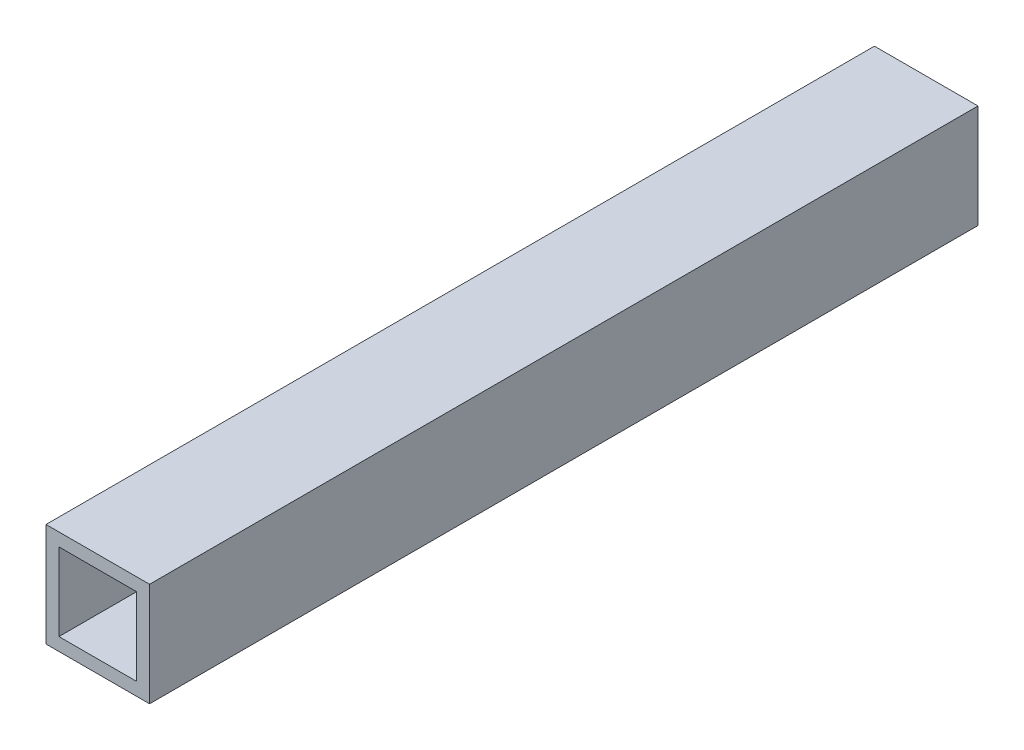
ISO-10303-21;
HEADER;
FILE_DESCRIPTION(('STEP AP214'),'2;1');
FILE_NAME('part.step','',(''),(''),'','','');
FILE_SCHEMA(('AUTOMOTIVE_DESIGN { 1 0 10303 214 1 1 1 1 }'));
ENDSEC;
DATA;
#1=APPLICATION_CONTEXT('core data for automotive mechanical design processes');
#2=APPLICATION_PROTOCOL_DEFINITION('international standard','automotive_design',2000,#1);
#3=PRODUCT_CONTEXT('',#1,'mechanical');
#4=PRODUCT('Part','Part','',(#3));
#5=PRODUCT_RELATED_PRODUCT_CATEGORY('part','',(#4));
#6=PRODUCT_DEFINITION_FORMATION('','',#4);
#7=PRODUCT_DEFINITION_CONTEXT('part definition',#1,'design');
#8=PRODUCT_DEFINITION('design','',#6,#7);
#9=PRODUCT_DEFINITION_SHAPE('','',#8);
#10=(LENGTH_UNIT() NAMED_UNIT(*) SI_UNIT(.MILLI.,.METRE.));
#11=(NAMED_UNIT(*) PLANE_ANGLE_UNIT() SI_UNIT($,.RADIAN.));
#12=(NAMED_UNIT(*) SI_UNIT($,.STERADIAN.) SOLID_ANGLE_UNIT());
#13=UNCERTAINTY_MEASURE_WITH_UNIT(LENGTH_MEASURE(1.E-05),#10,'distance_accuracy_value','');
#14=(GEOMETRIC_REPRESENTATION_CONTEXT(3) GLOBAL_UNCERTAINTY_ASSIGNED_CONTEXT((#13)) GLOBAL_UNIT_ASSIGNED_CONTEXT((#10,
#11,#12)) REPRESENTATION_CONTEXT('',''));
#15=CARTESIAN_POINT('',(0.,0.,0.));
#16=DIRECTION('',(0.,0.,1.));
#17=DIRECTION('',(1.,0.,0.));
#18=AXIS2_PLACEMENT_3D('',#15,#16,#17);
#19=CARTESIAN_POINT('',(0.,0.,203.2));
#20=DIRECTION('',(0.,0.,1.));
#21=DIRECTION('',(1.,0.,0.));
#22=AXIS2_PLACEMENT_3D('',#19,#20,#21);
#23=PLANE('',#22);
#24=DIRECTION('',(0.,1.,0.));
#25=VECTOR('',#24,1.);
#26=CARTESIAN_POINT('',(0.,0.,203.2));
#27=LINE('',#26,#25);
#28=CARTESIAN_POINT('',(0.,0.,203.2));
#29=VERTEX_POINT('',#28);
#30=CARTESIAN_POINT('',(0.,25.4,203.2));
#31=VERTEX_POINT('',#30);
#32=EDGE_CURVE('E176',#29,#31,#27,.T.);
#33=ORIENTED_EDGE('',*,*,#32,.T.);
#34=DIRECTION('',(-1.,0.,0.));
#35=VECTOR('',#34,1.);
#36=CARTESIAN_POINT('',(0.,25.4,203.2));
#37=LINE('',#36,#35);
#38=CARTESIAN_POINT('',(-25.4,25.4,203.2));
#39=VERTEX_POINT('',#38);
#40=EDGE_CURVE('E180',#31,#39,#37,.T.);
#41=ORIENTED_EDGE('',*,*,#40,.T.);
#42=DIRECTION('',(0.,-1.,0.));
#43=VECTOR('',#42,1.);
#44=CARTESIAN_POINT('',(-25.4,0.,203.2));
#45=LINE('',#44,#43);
#46=CARTESIAN_POINT('',(-25.4,0.,203.2));
#47=VERTEX_POINT('',#46);
#48=EDGE_CURVE('E184',#39,#47,#45,.T.);
#49=ORIENTED_EDGE('',*,*,#48,.T.);
#50=DIRECTION('',(1.,0.,0.));
#51=VECTOR('',#50,1.);
#52=CARTESIAN_POINT('',(0.,0.,203.2));
#53=LINE('',#52,#51);
#54=EDGE_CURVE('E187',#47,#29,#53,.T.);
#55=ORIENTED_EDGE('',*,*,#54,.T.);
#56=EDGE_LOOP('',(#33,#41,#49,#55));
#57=FACE_BOUND('',#56,.T.);
#58=DIRECTION('',(-1.,0.,0.));
#59=VECTOR('',#58,1.);
#60=CARTESIAN_POINT('',(0.,22.225,203.2));
#61=LINE('',#60,#59);
#62=CARTESIAN_POINT('',(-3.175,22.225,203.2));
#63=VERTEX_POINT('',#62);
#64=CARTESIAN_POINT('',(-22.225,22.225,203.2));
#65=VERTEX_POINT('',#64);
#66=EDGE_CURVE('E137',#63,#65,#61,.T.);
#67=ORIENTED_EDGE('',*,*,#66,.F.);
#68=DIRECTION('',(0.,1.,0.));
#69=VECTOR('',#68,1.);
#70=CARTESIAN_POINT('',(-3.175,0.,203.2));
#71=LINE('',#70,#69);
#72=CARTESIAN_POINT('',(-3.175,3.175,203.2));
#73=VERTEX_POINT('',#72);
#74=EDGE_CURVE('E128',#73,#63,#71,.T.);
#75=ORIENTED_EDGE('',*,*,#74,.F.);
#76=DIRECTION('',(1.,0.,0.));
#77=VECTOR('',#76,1.);
#78=CARTESIAN_POINT('',(0.,3.175,203.2));
#79=LINE('',#78,#77);
#80=CARTESIAN_POINT('',(-22.225,3.175,203.2));
#81=VERTEX_POINT('',#80);
#82=EDGE_CURVE('E154',#81,#73,#79,.T.);
#83=ORIENTED_EDGE('',*,*,#82,.F.);
#84=DIRECTION('',(0.,-1.,0.));
#85=VECTOR('',#84,1.);
#86=CARTESIAN_POINT('',(-22.225,0.,203.2));
#87=LINE('',#86,#85);
#88=EDGE_CURVE('E150',#65,#81,#87,.T.);
#89=ORIENTED_EDGE('',*,*,#88,.F.);
#90=EDGE_LOOP('',(#67,#75,#83,#89));
#91=FACE_BOUND('',#90,.T.);
#92=ADVANCED_FACE('F62',(#57,#91),#23,.T.);
#93=CARTESIAN_POINT('',(0.,0.,0.));
#94=DIRECTION('',(0.,0.,1.));
#95=DIRECTION('',(1.,0.,0.));
#96=AXIS2_PLACEMENT_3D('',#93,#94,#95);
#97=PLANE('',#96);
#98=DIRECTION('',(0.,1.,0.));
#99=VECTOR('',#98,1.);
#100=CARTESIAN_POINT('',(0.,0.,0.));
#101=LINE('',#100,#99);
#102=CARTESIAN_POINT('',(0.,0.,0.));
#103=VERTEX_POINT('',#102);
#104=CARTESIAN_POINT('',(0.,25.4,0.));
#105=VERTEX_POINT('',#104);
#106=EDGE_CURVE('E146',#103,#105,#101,.T.);
#107=ORIENTED_EDGE('',*,*,#106,.F.);
#108=DIRECTION('',(1.,0.,0.));
#109=VECTOR('',#108,1.);
#110=CARTESIAN_POINT('',(0.,0.,0.));
#111=LINE('',#110,#109);
#112=CARTESIAN_POINT('',(-25.4,0.,0.));
#113=VERTEX_POINT('',#112);
#114=EDGE_CURVE('E181',#113,#103,#111,.T.);
#115=ORIENTED_EDGE('',*,*,#114,.F.);
#116=DIRECTION('',(0.,-1.,0.));
#117=VECTOR('',#116,1.);
#118=CARTESIAN_POINT('',(-25.4,0.,0.));
#119=LINE('',#118,#117);
#120=CARTESIAN_POINT('',(-25.4,25.4,0.));
#121=VERTEX_POINT('',#120);
#122=EDGE_CURVE('E197',#121,#113,#119,.T.);
#123=ORIENTED_EDGE('',*,*,#122,.F.);
#124=DIRECTION('',(-1.,0.,0.));
#125=VECTOR('',#124,1.);
#126=CARTESIAN_POINT('',(0.,25.4,0.));
#127=LINE('',#126,#125);
#128=EDGE_CURVE('E194',#105,#121,#127,.T.);
#129=ORIENTED_EDGE('',*,*,#128,.F.);
#130=EDGE_LOOP('',(#107,#115,#123,#129));
#131=FACE_BOUND('',#130,.T.);
#132=DIRECTION('',(0.,1.,0.));
#133=VECTOR('',#132,1.);
#134=CARTESIAN_POINT('',(-3.175,0.,0.));
#135=LINE('',#134,#133);
#136=CARTESIAN_POINT('',(-3.175,3.175,0.));
#137=VERTEX_POINT('',#136);
#138=CARTESIAN_POINT('',(-3.175,22.225,0.));
#139=VERTEX_POINT('',#138);
#140=EDGE_CURVE('E86',#137,#139,#135,.T.);
#141=ORIENTED_EDGE('',*,*,#140,.T.);
#142=DIRECTION('',(-1.,0.,0.));
#143=VECTOR('',#142,1.);
#144=CARTESIAN_POINT('',(0.,22.225,0.));
#145=LINE('',#144,#143);
#146=CARTESIAN_POINT('',(-22.225,22.225,0.));
#147=VERTEX_POINT('',#146);
#148=EDGE_CURVE('E144',#139,#147,#145,.T.);
#149=ORIENTED_EDGE('',*,*,#148,.T.);
#150=DIRECTION('',(0.,-1.,0.));
#151=VECTOR('',#150,1.);
#152=CARTESIAN_POINT('',(-22.225,0.,0.));
#153=LINE('',#152,#151);
#154=CARTESIAN_POINT('',(-22.225,3.175,0.));
#155=VERTEX_POINT('',#154);
#156=EDGE_CURVE('E163',#147,#155,#153,.T.);
#157=ORIENTED_EDGE('',*,*,#156,.T.);
#158=DIRECTION('',(1.,0.,0.));
#159=VECTOR('',#158,1.);
#160=CARTESIAN_POINT('',(0.,3.175,0.));
#161=LINE('',#160,#159);
#162=EDGE_CURVE('E138',#155,#137,#161,.T.);
#163=ORIENTED_EDGE('',*,*,#162,.T.);
#164=EDGE_LOOP('',(#141,#149,#157,#163));
#165=FACE_BOUND('',#164,.T.);
#166=ADVANCED_FACE('F220',(#131,#165),#97,.F.);
#167=CARTESIAN_POINT('',(0.,0.,203.2));
#168=DIRECTION('',(-1.,0.,0.));
#169=DIRECTION('',(0.,-1.,0.));
#170=AXIS2_PLACEMENT_3D('',#167,#168,#169);
#171=PLANE('',#170);
#172=ORIENTED_EDGE('',*,*,#106,.T.);
#173=DIRECTION('',(0.,0.,-1.));
#174=VECTOR('',#173,1.);
#175=CARTESIAN_POINT('',(0.,25.4,203.2));
#176=LINE('',#175,#174);
#177=EDGE_CURVE('E12',#31,#105,#176,.T.);
#178=ORIENTED_EDGE('',*,*,#177,.F.);
#179=ORIENTED_EDGE('',*,*,#32,.F.);
#180=DIRECTION('',(0.,0.,-1.));
#181=VECTOR('',#180,1.);
#182=CARTESIAN_POINT('',(0.,0.,203.2));
#183=LINE('',#182,#181);
#184=EDGE_CURVE('E190',#29,#103,#183,.T.);
#185=ORIENTED_EDGE('',*,*,#184,.T.);
#186=EDGE_LOOP('',(#172,#178,#179,#185));
#187=FACE_BOUND('',#186,.T.);
#188=ADVANCED_FACE('F64',(#187),#171,.F.);
#189=CARTESIAN_POINT('',(0.,25.4,203.2));
#190=DIRECTION('',(0.,-1.,0.));
#191=DIRECTION('',(1.,0.,0.));
#192=AXIS2_PLACEMENT_3D('',#189,#190,#191);
#193=PLANE('',#192);
#194=ORIENTED_EDGE('',*,*,#128,.T.);
#195=DIRECTION('',(0.,0.,-1.));
#196=VECTOR('',#195,1.);
#197=CARTESIAN_POINT('',(-25.4,25.4,203.2));
#198=LINE('',#197,#196);
#199=EDGE_CURVE('E71',#39,#121,#198,.T.);
#200=ORIENTED_EDGE('',*,*,#199,.F.);
#201=ORIENTED_EDGE('',*,*,#40,.F.);
#202=ORIENTED_EDGE('',*,*,#177,.T.);
#203=EDGE_LOOP('',(#194,#200,#201,#202));
#204=FACE_BOUND('',#203,.T.);
#205=ADVANCED_FACE('F230',(#204),#193,.F.);
#206=CARTESIAN_POINT('',(-25.4,0.,203.2));
#207=DIRECTION('',(1.,0.,0.));
#208=DIRECTION('',(0.,0.,-1.));
#209=AXIS2_PLACEMENT_3D('',#206,#207,#208);
#210=PLANE('',#209);
#211=ORIENTED_EDGE('',*,*,#122,.T.);
#212=DIRECTION('',(0.,0.,-1.));
#213=VECTOR('',#212,1.);
#214=CARTESIAN_POINT('',(-25.4,0.,203.2));
#215=LINE('',#214,#213);
#216=EDGE_CURVE('E205',#47,#113,#215,.T.);
#217=ORIENTED_EDGE('',*,*,#216,.F.);
#218=ORIENTED_EDGE('',*,*,#48,.F.);
#219=ORIENTED_EDGE('',*,*,#199,.T.);
#220=EDGE_LOOP('',(#211,#217,#218,#219));
#221=FACE_BOUND('',#220,.T.);
#222=ADVANCED_FACE('F214',(#221),#210,.F.);
#223=CARTESIAN_POINT('',(0.,0.,203.2));
#224=DIRECTION('',(0.,1.,0.));
#225=DIRECTION('',(0.,0.,1.));
#226=AXIS2_PLACEMENT_3D('',#223,#224,#225);
#227=PLANE('',#226);
#228=ORIENTED_EDGE('',*,*,#114,.T.);
#229=ORIENTED_EDGE('',*,*,#184,.F.);
#230=ORIENTED_EDGE('',*,*,#54,.F.);
#231=ORIENTED_EDGE('',*,*,#216,.T.);
#232=EDGE_LOOP('',(#228,#229,#230,#231));
#233=FACE_BOUND('',#232,.T.);
#234=ADVANCED_FACE('F224',(#233),#227,.F.);
#235=CARTESIAN_POINT('',(-3.175,0.,203.2));
#236=DIRECTION('',(-1.,0.,0.));
#237=DIRECTION('',(0.,-1.,0.));
#238=AXIS2_PLACEMENT_3D('',#235,#236,#237);
#239=PLANE('',#238);
#240=ORIENTED_EDGE('',*,*,#140,.F.);
#241=DIRECTION('',(0.,0.,-1.));
#242=VECTOR('',#241,1.);
#243=CARTESIAN_POINT('',(-3.175,3.175,203.2));
#244=LINE('',#243,#242);
#245=EDGE_CURVE('E132',#73,#137,#244,.T.);
#246=ORIENTED_EDGE('',*,*,#245,.F.);
#247=ORIENTED_EDGE('',*,*,#74,.T.);
#248=DIRECTION('',(0.,0.,-1.));
#249=VECTOR('',#248,1.);
#250=CARTESIAN_POINT('',(-3.175,22.225,203.2));
#251=LINE('',#250,#249);
#252=EDGE_CURVE('E131',#63,#139,#251,.T.);
#253=ORIENTED_EDGE('',*,*,#252,.T.);
#254=EDGE_LOOP('',(#240,#246,#247,#253));
#255=FACE_BOUND('',#254,.T.);
#256=ADVANCED_FACE('F130',(#255),#239,.T.);
#257=CARTESIAN_POINT('',(0.,22.225,203.2));
#258=DIRECTION('',(0.,-1.,0.));
#259=DIRECTION('',(1.,0.,0.));
#260=AXIS2_PLACEMENT_3D('',#257,#258,#259);
#261=PLANE('',#260);
#262=ORIENTED_EDGE('',*,*,#148,.F.);
#263=ORIENTED_EDGE('',*,*,#252,.F.);
#264=ORIENTED_EDGE('',*,*,#66,.T.);
#265=DIRECTION('',(0.,0.,-1.));
#266=VECTOR('',#265,1.);
#267=CARTESIAN_POINT('',(-22.225,22.225,203.2));
#268=LINE('',#267,#266);
#269=EDGE_CURVE('E147',#65,#147,#268,.T.);
#270=ORIENTED_EDGE('',*,*,#269,.T.);
#271=EDGE_LOOP('',(#262,#263,#264,#270));
#272=FACE_BOUND('',#271,.T.);
#273=ADVANCED_FACE('F141',(#272),#261,.T.);
#274=CARTESIAN_POINT('',(-22.225,0.,203.2));
#275=DIRECTION('',(1.,0.,0.));
#276=DIRECTION('',(0.,0.,-1.));
#277=AXIS2_PLACEMENT_3D('',#274,#275,#276);
#278=PLANE('',#277);
#279=ORIENTED_EDGE('',*,*,#156,.F.);
#280=ORIENTED_EDGE('',*,*,#269,.F.);
#281=ORIENTED_EDGE('',*,*,#88,.T.);
#282=DIRECTION('',(0.,0.,-1.));
#283=VECTOR('',#282,1.);
#284=CARTESIAN_POINT('',(-22.225,3.175,203.2));
#285=LINE('',#284,#283);
#286=EDGE_CURVE('E78',#81,#155,#285,.T.);
#287=ORIENTED_EDGE('',*,*,#286,.T.);
#288=EDGE_LOOP('',(#279,#280,#281,#287));
#289=FACE_BOUND('',#288,.T.);
#290=ADVANCED_FACE('F253',(#289),#278,.T.);
#291=CARTESIAN_POINT('',(0.,3.175,203.2));
#292=DIRECTION('',(0.,1.,0.));
#293=DIRECTION('',(0.,0.,1.));
#294=AXIS2_PLACEMENT_3D('',#291,#292,#293);
#295=PLANE('',#294);
#296=ORIENTED_EDGE('',*,*,#162,.F.);
#297=ORIENTED_EDGE('',*,*,#286,.F.);
#298=ORIENTED_EDGE('',*,*,#82,.T.);
#299=ORIENTED_EDGE('',*,*,#245,.T.);
#300=EDGE_LOOP('',(#296,#297,#298,#299));
#301=FACE_BOUND('',#300,.T.);
#302=ADVANCED_FACE('F257',(#301),#295,.T.);
#303=CLOSED_SHELL('',(#92,#166,#188,#205,#222,#234,#256,#273,#290,#302));
#304=MANIFOLD_SOLID_BREP('B2',#303);
#305=ADVANCED_BREP_SHAPE_REPRESENTATION('',(#18,#304),#14);
#306=SHAPE_DEFINITION_REPRESENTATION(#9,#305);
ENDSEC;
END-ISO-10303-21;
